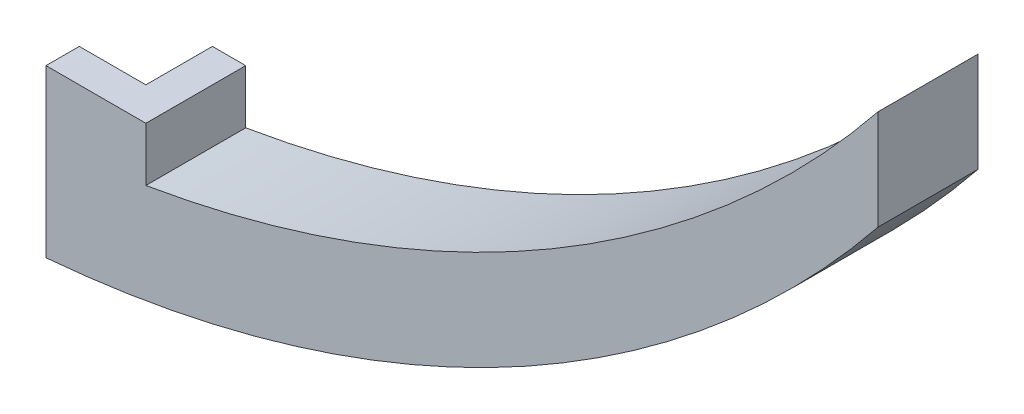
ISO-10303-21;
HEADER;
FILE_DESCRIPTION(('STEP AP214'),'2;1');
FILE_NAME('part.step','',(''),(''),'','','');
FILE_SCHEMA(('AUTOMOTIVE_DESIGN { 1 0 10303 214 1 1 1 1 }'));
ENDSEC;
DATA;
#1=APPLICATION_CONTEXT('core data for automotive mechanical design processes');
#2=APPLICATION_PROTOCOL_DEFINITION('international standard','automotive_design',2000,#1);
#3=PRODUCT_CONTEXT('',#1,'mechanical');
#4=PRODUCT('Part','Part','',(#3));
#5=PRODUCT_RELATED_PRODUCT_CATEGORY('part','',(#4));
#6=PRODUCT_DEFINITION_FORMATION('','',#4);
#7=PRODUCT_DEFINITION_CONTEXT('part definition',#1,'design');
#8=PRODUCT_DEFINITION('design','',#6,#7);
#9=PRODUCT_DEFINITION_SHAPE('','',#8);
#10=(LENGTH_UNIT() NAMED_UNIT(*) SI_UNIT(.MILLI.,.METRE.));
#11=(NAMED_UNIT(*) PLANE_ANGLE_UNIT() SI_UNIT($,.RADIAN.));
#12=(NAMED_UNIT(*) SI_UNIT($,.STERADIAN.) SOLID_ANGLE_UNIT());
#13=UNCERTAINTY_MEASURE_WITH_UNIT(LENGTH_MEASURE(1.E-05),#10,'distance_accuracy_value','');
#14=(GEOMETRIC_REPRESENTATION_CONTEXT(3) GLOBAL_UNCERTAINTY_ASSIGNED_CONTEXT((#13)) GLOBAL_UNIT_ASSIGNED_CONTEXT((#10,
#11,#12)) REPRESENTATION_CONTEXT('',''));
#15=CARTESIAN_POINT('',(0.,0.,0.));
#16=DIRECTION('',(0.,0.,1.));
#17=DIRECTION('',(1.,0.,0.));
#18=AXIS2_PLACEMENT_3D('',#15,#16,#17);
#19=CARTESIAN_POINT('',(-30.2937484008937,388.399250917739,30.));
#20=DIRECTION('',(0.,0.,-1.));
#21=DIRECTION('',(-1.,0.,0.));
#22=AXIS2_PLACEMENT_3D('',#19,#20,#21);
#23=CYLINDRICAL_SURFACE('',#22,359.677264016747);
#24=DIRECTION('',(0.,0.,-1.));
#25=VECTOR('',#24,1.);
#26=CARTESIAN_POINT('',(30.,33.8116056812716,30.0000000000001));
#27=LINE('',#26,#25);
#28=CARTESIAN_POINT('',(30.,33.8116056812716,30.));
#29=VERTEX_POINT('',#28);
#30=CARTESIAN_POINT('',(30.,33.8116056812717,0.));
#31=VERTEX_POINT('',#30);
#32=EDGE_CURVE('E52',#29,#31,#27,.T.);
#33=ORIENTED_EDGE('',*,*,#32,.F.);
#34=CARTESIAN_POINT('',(-30.2937484008937,388.399250917739,30.));
#35=DIRECTION('',(0.,0.,-1.));
#36=DIRECTION('',(1.,0.,0.));
#37=AXIS2_PLACEMENT_3D('',#34,#35,#36);
#38=CIRCLE('',#37,359.677264016747);
#39=CARTESIAN_POINT('',(250.,163.003712235294,30.));
#40=VERTEX_POINT('',#39);
#41=EDGE_CURVE('E119',#40,#29,#38,.T.);
#42=ORIENTED_EDGE('',*,*,#41,.F.);
#43=DIRECTION('',(0.,0.,-1.));
#44=VECTOR('',#43,1.);
#45=CARTESIAN_POINT('',(250.,163.003712235294,30.));
#46=LINE('',#45,#44);
#47=CARTESIAN_POINT('',(250.,163.003712235294,0.));
#48=VERTEX_POINT('',#47);
#49=EDGE_CURVE('E170',#40,#48,#46,.T.);
#50=ORIENTED_EDGE('',*,*,#49,.T.);
#51=CARTESIAN_POINT('',(-30.2937484008937,388.399250917739,0.));
#52=DIRECTION('',(0.,0.,-1.));
#53=DIRECTION('',(1.,0.,0.));
#54=AXIS2_PLACEMENT_3D('',#51,#52,#53);
#55=CIRCLE('',#54,359.677264016747);
#56=EDGE_CURVE('E48',#48,#31,#55,.T.);
#57=ORIENTED_EDGE('',*,*,#56,.T.);
#58=EDGE_LOOP('',(#33,#42,#50,#57));
#59=FACE_BOUND('',#58,.T.);
#60=ADVANCED_FACE('F33',(#59),#23,.F.);
#61=CARTESIAN_POINT('',(-30.2937484008937,358.399250917739,0.));
#62=DIRECTION('',(0.,0.,1.));
#63=DIRECTION('',(1.,0.,0.));
#64=AXIS2_PLACEMENT_3D('',#61,#62,#63);
#65=PLANE('',#64);
#66=DIRECTION('',(0.,-1.,0.));
#67=VECTOR('',#66,1.);
#68=CARTESIAN_POINT('',(20.,358.399250917739,0.));
#69=LINE('',#68,#67);
#70=CARTESIAN_POINT('',(20.,50.,0.));
#71=VERTEX_POINT('',#70);
#72=CARTESIAN_POINT('',(20.,30.,0.));
#73=VERTEX_POINT('',#72);
#74=EDGE_CURVE('E11',#71,#73,#69,.T.);
#75=ORIENTED_EDGE('',*,*,#74,.F.);
#76=DIRECTION('',(-1.,0.,0.));
#77=VECTOR('',#76,1.);
#78=CARTESIAN_POINT('',(30.,50.,0.));
#79=LINE('',#78,#77);
#80=CARTESIAN_POINT('',(30.,50.,0.));
#81=VERTEX_POINT('',#80);
#82=EDGE_CURVE('E126',#81,#71,#79,.T.);
#83=ORIENTED_EDGE('',*,*,#82,.F.);
#84=DIRECTION('',(0.,-1.,0.));
#85=VECTOR('',#84,1.);
#86=CARTESIAN_POINT('',(30.,50.,0.));
#87=LINE('',#86,#85);
#88=EDGE_CURVE('E121',#81,#31,#87,.T.);
#89=ORIENTED_EDGE('',*,*,#88,.T.);
#90=ORIENTED_EDGE('',*,*,#56,.F.);
#91=DIRECTION('',(0.,1.,0.));
#92=VECTOR('',#91,1.);
#93=CARTESIAN_POINT('',(250.,133.003712235294,0.));
#94=LINE('',#93,#92);
#95=CARTESIAN_POINT('',(250.,133.003712235294,0.));
#96=VERTEX_POINT('',#95);
#97=EDGE_CURVE('E164',#96,#48,#94,.T.);
#98=ORIENTED_EDGE('',*,*,#97,.F.);
#99=CARTESIAN_POINT('',(-30.2937484008937,358.399250917739,0.));
#100=DIRECTION('',(0.,0.,1.));
#101=DIRECTION('',(1.,0.,0.));
#102=AXIS2_PLACEMENT_3D('',#99,#100,#101);
#103=CIRCLE('',#102,359.677264016747);
#104=CARTESIAN_POINT('',(0.,0.,0.));
#105=VERTEX_POINT('',#104);
#106=EDGE_CURVE('E151',#105,#96,#103,.T.);
#107=ORIENTED_EDGE('',*,*,#106,.F.);
#108=DIRECTION('',(0.,-1.,0.));
#109=VECTOR('',#108,1.);
#110=CARTESIAN_POINT('',(0.,0.,0.));
#111=LINE('',#110,#109);
#112=CARTESIAN_POINT('',(0.,30.,0.));
#113=VERTEX_POINT('',#112);
#114=EDGE_CURVE('E156',#113,#105,#111,.T.);
#115=ORIENTED_EDGE('',*,*,#114,.F.);
#116=DIRECTION('',(-1.,0.,0.));
#117=VECTOR('',#116,1.);
#118=CARTESIAN_POINT('',(20.,30.,0.));
#119=LINE('',#118,#117);
#120=EDGE_CURVE('E139',#73,#113,#119,.T.);
#121=ORIENTED_EDGE('',*,*,#120,.F.);
#122=EDGE_LOOP('',(#75,#83,#89,#90,#98,#107,#115,#121));
#123=FACE_BOUND('',#122,.T.);
#124=ADVANCED_FACE('F182',(#123),#65,.F.);
#125=CARTESIAN_POINT('',(-30.2937484008937,358.399250917739,30.));
#126=DIRECTION('',(0.,0.,-1.));
#127=DIRECTION('',(-1.,0.,0.));
#128=AXIS2_PLACEMENT_3D('',#125,#126,#127);
#129=CYLINDRICAL_SURFACE('',#128,359.677264016747);
#130=ORIENTED_EDGE('',*,*,#106,.T.);
#131=DIRECTION('',(0.,0.,-1.));
#132=VECTOR('',#131,1.);
#133=CARTESIAN_POINT('',(250.,133.003712235294,30.));
#134=LINE('',#133,#132);
#135=CARTESIAN_POINT('',(250.,133.003712235294,30.));
#136=VERTEX_POINT('',#135);
#137=EDGE_CURVE('E41',#136,#96,#134,.T.);
#138=ORIENTED_EDGE('',*,*,#137,.F.);
#139=CARTESIAN_POINT('',(-30.2937484008937,358.399250917739,30.));
#140=DIRECTION('',(0.,0.,1.));
#141=DIRECTION('',(1.,0.,0.));
#142=AXIS2_PLACEMENT_3D('',#139,#140,#141);
#143=CIRCLE('',#142,359.677264016747);
#144=CARTESIAN_POINT('',(0.,0.,30.));
#145=VERTEX_POINT('',#144);
#146=EDGE_CURVE('E152',#145,#136,#143,.T.);
#147=ORIENTED_EDGE('',*,*,#146,.F.);
#148=DIRECTION('',(0.,0.,-1.));
#149=VECTOR('',#148,1.);
#150=CARTESIAN_POINT('',(0.,0.,30.));
#151=LINE('',#150,#149);
#152=EDGE_CURVE('E161',#145,#105,#151,.T.);
#153=ORIENTED_EDGE('',*,*,#152,.T.);
#154=EDGE_LOOP('',(#130,#138,#147,#153));
#155=FACE_BOUND('',#154,.T.);
#156=ADVANCED_FACE('F35',(#155),#129,.T.);
#157=CARTESIAN_POINT('',(250.,133.003712235294,30.));
#158=DIRECTION('',(-1.,0.,0.));
#159=DIRECTION('',(0.,0.,1.));
#160=AXIS2_PLACEMENT_3D('',#157,#158,#159);
#161=PLANE('',#160);
#162=ORIENTED_EDGE('',*,*,#97,.T.);
#163=ORIENTED_EDGE('',*,*,#49,.F.);
#164=DIRECTION('',(0.,1.,0.));
#165=VECTOR('',#164,1.);
#166=CARTESIAN_POINT('',(250.,133.003712235294,30.));
#167=LINE('',#166,#165);
#168=EDGE_CURVE('E155',#136,#40,#167,.T.);
#169=ORIENTED_EDGE('',*,*,#168,.F.);
#170=ORIENTED_EDGE('',*,*,#137,.T.);
#171=EDGE_LOOP('',(#162,#163,#169,#170));
#172=FACE_BOUND('',#171,.T.);
#173=ADVANCED_FACE('F174',(#172),#161,.F.);
#174=CARTESIAN_POINT('',(0.,0.,30.));
#175=DIRECTION('',(1.,0.,0.));
#176=DIRECTION('',(0.,0.,-1.));
#177=AXIS2_PLACEMENT_3D('',#174,#175,#176);
#178=PLANE('',#177);
#179=ORIENTED_EDGE('',*,*,#114,.T.);
#180=ORIENTED_EDGE('',*,*,#152,.F.);
#181=DIRECTION('',(0.,-1.,0.));
#182=VECTOR('',#181,1.);
#183=CARTESIAN_POINT('',(0.,0.,30.));
#184=LINE('',#183,#182);
#185=CARTESIAN_POINT('',(0.,50.,30.));
#186=VERTEX_POINT('',#185);
#187=EDGE_CURVE('E159',#186,#145,#184,.T.);
#188=ORIENTED_EDGE('',*,*,#187,.F.);
#189=DIRECTION('',(0.,0.,1.));
#190=VECTOR('',#189,1.);
#191=CARTESIAN_POINT('',(0.,50.,20.));
#192=LINE('',#191,#190);
#193=CARTESIAN_POINT('',(0.,50.,20.));
#194=VERTEX_POINT('',#193);
#195=EDGE_CURVE('E112',#194,#186,#192,.T.);
#196=ORIENTED_EDGE('',*,*,#195,.F.);
#197=DIRECTION('',(0.,-1.,0.));
#198=VECTOR('',#197,1.);
#199=CARTESIAN_POINT('',(0.,30.,20.));
#200=LINE('',#199,#198);
#201=CARTESIAN_POINT('',(0.,30.,20.));
#202=VERTEX_POINT('',#201);
#203=EDGE_CURVE('E136',#194,#202,#200,.T.);
#204=ORIENTED_EDGE('',*,*,#203,.T.);
#205=DIRECTION('',(0.,0.,1.));
#206=VECTOR('',#205,1.);
#207=CARTESIAN_POINT('',(0.,30.,0.));
#208=LINE('',#207,#206);
#209=EDGE_CURVE('E141',#113,#202,#208,.T.);
#210=ORIENTED_EDGE('',*,*,#209,.F.);
#211=EDGE_LOOP('',(#179,#180,#188,#196,#204,#210));
#212=FACE_BOUND('',#211,.T.);
#213=ADVANCED_FACE('F195',(#212),#178,.F.);
#214=CARTESIAN_POINT('',(-30.2937484008937,358.399250917739,30.));
#215=DIRECTION('',(0.,0.,1.));
#216=DIRECTION('',(1.,0.,0.));
#217=AXIS2_PLACEMENT_3D('',#214,#215,#216);
#218=PLANE('',#217);
#219=ORIENTED_EDGE('',*,*,#41,.T.);
#220=DIRECTION('',(0.,1.,0.));
#221=VECTOR('',#220,1.);
#222=CARTESIAN_POINT('',(30.,32.2556378592416,30.));
#223=LINE('',#222,#221);
#224=CARTESIAN_POINT('',(30.,50.,30.));
#225=VERTEX_POINT('',#224);
#226=EDGE_CURVE('E117',#29,#225,#223,.T.);
#227=ORIENTED_EDGE('',*,*,#226,.T.);
#228=DIRECTION('',(-1.,0.,0.));
#229=VECTOR('',#228,1.);
#230=CARTESIAN_POINT('',(0.,50.,30.));
#231=LINE('',#230,#229);
#232=EDGE_CURVE('E105',#225,#186,#231,.T.);
#233=ORIENTED_EDGE('',*,*,#232,.T.);
#234=ORIENTED_EDGE('',*,*,#187,.T.);
#235=ORIENTED_EDGE('',*,*,#146,.T.);
#236=ORIENTED_EDGE('',*,*,#168,.T.);
#237=EDGE_LOOP('',(#219,#227,#233,#234,#235,#236));
#238=FACE_BOUND('',#237,.T.);
#239=ADVANCED_FACE('F118',(#238),#218,.T.);
#240=CARTESIAN_POINT('',(0.,40.,20.));
#241=DIRECTION('',(0.,0.,-1.));
#242=DIRECTION('',(-1.,0.,0.));
#243=AXIS2_PLACEMENT_3D('',#240,#241,#242);
#244=PLANE('',#243);
#245=DIRECTION('',(1.,0.,0.));
#246=VECTOR('',#245,1.);
#247=CARTESIAN_POINT('',(0.,30.,20.));
#248=LINE('',#247,#246);
#249=CARTESIAN_POINT('',(20.,30.,20.));
#250=VERTEX_POINT('',#249);
#251=EDGE_CURVE('E144',#202,#250,#248,.T.);
#252=ORIENTED_EDGE('',*,*,#251,.F.);
#253=ORIENTED_EDGE('',*,*,#203,.F.);
#254=DIRECTION('',(-1.,0.,0.));
#255=VECTOR('',#254,1.);
#256=CARTESIAN_POINT('',(0.,50.,20.));
#257=LINE('',#256,#255);
#258=CARTESIAN_POINT('',(20.,50.,20.));
#259=VERTEX_POINT('',#258);
#260=EDGE_CURVE('E114',#259,#194,#257,.T.);
#261=ORIENTED_EDGE('',*,*,#260,.F.);
#262=DIRECTION('',(0.,-1.,0.));
#263=VECTOR('',#262,1.);
#264=CARTESIAN_POINT('',(20.,40.,20.));
#265=LINE('',#264,#263);
#266=EDGE_CURVE('E149',#259,#250,#265,.T.);
#267=ORIENTED_EDGE('',*,*,#266,.T.);
#268=EDGE_LOOP('',(#252,#253,#261,#267));
#269=FACE_BOUND('',#268,.T.);
#270=ADVANCED_FACE('F192',(#269),#244,.T.);
#271=CARTESIAN_POINT('',(20.,40.,20.));
#272=DIRECTION('',(-1.,0.,0.));
#273=DIRECTION('',(0.,0.,1.));
#274=AXIS2_PLACEMENT_3D('',#271,#272,#273);
#275=PLANE('',#274);
#276=ORIENTED_EDGE('',*,*,#266,.F.);
#277=DIRECTION('',(0.,0.,-1.));
#278=VECTOR('',#277,1.);
#279=CARTESIAN_POINT('',(20.,50.,30.));
#280=LINE('',#279,#278);
#281=EDGE_CURVE('E131',#259,#71,#280,.T.);
#282=ORIENTED_EDGE('',*,*,#281,.T.);
#283=ORIENTED_EDGE('',*,*,#74,.T.);
#284=DIRECTION('',(0.,0.,-1.));
#285=VECTOR('',#284,1.);
#286=CARTESIAN_POINT('',(20.,30.,20.));
#287=LINE('',#286,#285);
#288=EDGE_CURVE('E147',#250,#73,#287,.T.);
#289=ORIENTED_EDGE('',*,*,#288,.F.);
#290=EDGE_LOOP('',(#276,#282,#283,#289));
#291=FACE_BOUND('',#290,.T.);
#292=ADVANCED_FACE('F188',(#291),#275,.T.);
#293=CARTESIAN_POINT('',(0.,30.,0.));
#294=DIRECTION('',(0.,1.,0.));
#295=DIRECTION('',(0.,0.,1.));
#296=AXIS2_PLACEMENT_3D('',#293,#294,#295);
#297=PLANE('',#296);
#298=ORIENTED_EDGE('',*,*,#120,.T.);
#299=ORIENTED_EDGE('',*,*,#209,.T.);
#300=ORIENTED_EDGE('',*,*,#251,.T.);
#301=ORIENTED_EDGE('',*,*,#288,.T.);
#302=EDGE_LOOP('',(#298,#299,#300,#301));
#303=FACE_BOUND('',#302,.T.);
#304=ADVANCED_FACE('F197',(#303),#297,.T.);
#305=CARTESIAN_POINT('',(0.,50.,20.));
#306=DIRECTION('',(0.,1.,0.));
#307=DIRECTION('',(0.,0.,1.));
#308=AXIS2_PLACEMENT_3D('',#305,#306,#307);
#309=PLANE('',#308);
#310=ORIENTED_EDGE('',*,*,#232,.F.);
#311=DIRECTION('',(0.,0.,-1.));
#312=VECTOR('',#311,1.);
#313=CARTESIAN_POINT('',(30.,50.,30.));
#314=LINE('',#313,#312);
#315=EDGE_CURVE('E110',#225,#81,#314,.T.);
#316=ORIENTED_EDGE('',*,*,#315,.T.);
#317=ORIENTED_EDGE('',*,*,#82,.T.);
#318=ORIENTED_EDGE('',*,*,#281,.F.);
#319=ORIENTED_EDGE('',*,*,#260,.T.);
#320=ORIENTED_EDGE('',*,*,#195,.T.);
#321=EDGE_LOOP('',(#310,#316,#317,#318,#319,#320));
#322=FACE_BOUND('',#321,.T.);
#323=ADVANCED_FACE('F107',(#322),#309,.T.);
#324=CARTESIAN_POINT('',(30.,0.,0.));
#325=DIRECTION('',(-1.,0.,0.));
#326=DIRECTION('',(0.,0.,1.));
#327=AXIS2_PLACEMENT_3D('',#324,#325,#326);
#328=PLANE('',#327);
#329=ORIENTED_EDGE('',*,*,#226,.F.);
#330=ORIENTED_EDGE('',*,*,#32,.T.);
#331=ORIENTED_EDGE('',*,*,#88,.F.);
#332=ORIENTED_EDGE('',*,*,#315,.F.);
#333=EDGE_LOOP('',(#329,#330,#331,#332));
#334=FACE_BOUND('',#333,.T.);
#335=ADVANCED_FACE('F124',(#334),#328,.F.);
#336=CLOSED_SHELL('',(#60,#124,#156,#173,#213,#239,#270,#292,#304,#323,#335));
#337=MANIFOLD_SOLID_BREP('B2',#336);
#338=ADVANCED_BREP_SHAPE_REPRESENTATION('',(#18,#337),#14);
#339=SHAPE_DEFINITION_REPRESENTATION(#9,#338);
ENDSEC;
END-ISO-10303-21;
